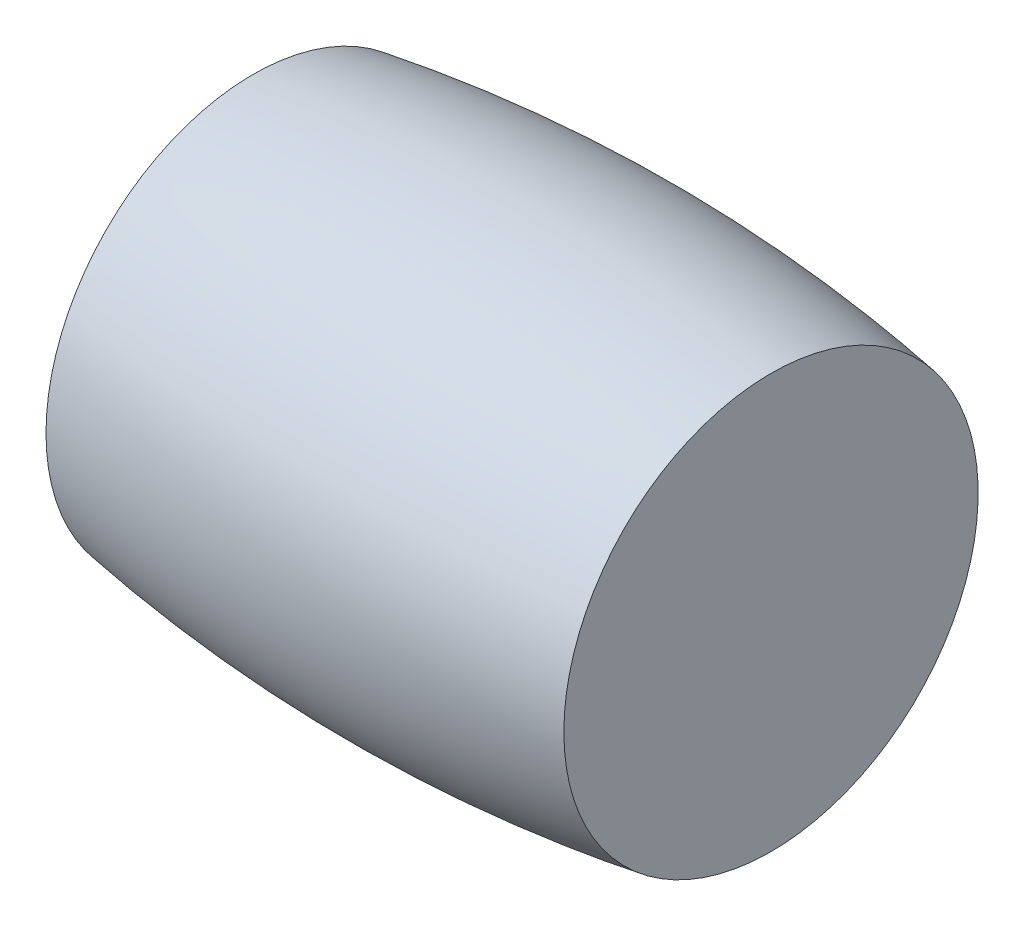
ISO-10303-21;
HEADER;
FILE_DESCRIPTION(('STEP AP214'),'2;1');
FILE_NAME('part.step','',(''),(''),'','','');
FILE_SCHEMA(('AUTOMOTIVE_DESIGN { 1 0 10303 214 1 1 1 1 }'));
ENDSEC;
DATA;
#1=APPLICATION_CONTEXT('core data for automotive mechanical design processes');
#2=APPLICATION_PROTOCOL_DEFINITION('international standard','automotive_design',2000,#1);
#3=PRODUCT_CONTEXT('',#1,'mechanical');
#4=PRODUCT('Part','Part','',(#3));
#5=PRODUCT_RELATED_PRODUCT_CATEGORY('part','',(#4));
#6=PRODUCT_DEFINITION_FORMATION('','',#4);
#7=PRODUCT_DEFINITION_CONTEXT('part definition',#1,'design');
#8=PRODUCT_DEFINITION('design','',#6,#7);
#9=PRODUCT_DEFINITION_SHAPE('','',#8);
#10=(LENGTH_UNIT() NAMED_UNIT(*) SI_UNIT(.MILLI.,.METRE.));
#11=(NAMED_UNIT(*) PLANE_ANGLE_UNIT() SI_UNIT($,.RADIAN.));
#12=(NAMED_UNIT(*) SI_UNIT($,.STERADIAN.) SOLID_ANGLE_UNIT());
#13=UNCERTAINTY_MEASURE_WITH_UNIT(LENGTH_MEASURE(1.E-05),#10,'distance_accuracy_value','');
#14=(GEOMETRIC_REPRESENTATION_CONTEXT(3) GLOBAL_UNCERTAINTY_ASSIGNED_CONTEXT((#13)) GLOBAL_UNIT_ASSIGNED_CONTEXT((#10,
#11,#12)) REPRESENTATION_CONTEXT('',''));
#15=CARTESIAN_POINT('',(0.,0.,0.));
#16=DIRECTION('',(0.,0.,1.));
#17=DIRECTION('',(1.,0.,0.));
#18=AXIS2_PLACEMENT_3D('',#15,#16,#17);
#19=CARTESIAN_POINT('',(7.5,0.,0.));
#20=DIRECTION('',(-1.,0.,0.));
#21=DIRECTION('',(0.,0.,1.));
#22=AXIS2_PLACEMENT_3D('',#19,#20,#21);
#23=PLANE('',#22);
#24=CARTESIAN_POINT('',(7.50000000000001,0.,0.));
#25=DIRECTION('',(-1.,0.,0.));
#26=DIRECTION('',(0.,0.,1.));
#27=AXIS2_PLACEMENT_3D('',#24,#25,#26);
#28=CIRCLE('',#27,6.);
#29=CARTESIAN_POINT('',(7.50000000000001,0.,6.));
#30=VERTEX_POINT('',#29);
#31=EDGE_CURVE('E10',#30,#30,#28,.T.);
#32=ORIENTED_EDGE('',*,*,#31,.F.);
#33=EDGE_LOOP('',(#32));
#34=FACE_BOUND('',#33,.T.);
#35=ADVANCED_FACE('F38',(#34),#23,.F.);
#36=CARTESIAN_POINT('',(0.,0.,0.));
#37=DIRECTION('',(-1.,0.,0.));
#38=DIRECTION('',(0.,0.,1.));
#39=AXIS2_PLACEMENT_3D('',#36,#37,#38);
#40=DEGENERATE_TOROIDAL_SURFACE('',#39,40.575,47.175,.F.);
#41=CARTESIAN_POINT('',(-7.5,0.,0.));
#42=DIRECTION('',(-1.,0.,0.));
#43=DIRECTION('',(0.,0.,1.));
#44=AXIS2_PLACEMENT_3D('',#41,#42,#43);
#45=CIRCLE('',#44,6.);
#46=CARTESIAN_POINT('',(-7.5,0.,6.));
#47=VERTEX_POINT('',#46);
#48=EDGE_CURVE('E44',#47,#47,#45,.T.);
#49=ORIENTED_EDGE('',*,*,#48,.F.);
#50=EDGE_LOOP('',(#49));
#51=FACE_BOUND('',#50,.T.);
#52=ORIENTED_EDGE('',*,*,#31,.T.);
#53=EDGE_LOOP('',(#52));
#54=FACE_BOUND('',#53,.T.);
#55=ADVANCED_FACE('F52',(#51,#54),#40,.F.);
#56=CARTESIAN_POINT('',(-7.5,0.,0.));
#57=DIRECTION('',(1.,0.,0.));
#58=DIRECTION('',(0.,0.,-1.));
#59=AXIS2_PLACEMENT_3D('',#56,#57,#58);
#60=PLANE('',#59);
#61=ORIENTED_EDGE('',*,*,#48,.T.);
#62=EDGE_LOOP('',(#61));
#63=FACE_BOUND('',#62,.T.);
#64=ADVANCED_FACE('F50',(#63),#60,.F.);
#65=CLOSED_SHELL('',(#35,#55,#64));
#66=MANIFOLD_SOLID_BREP('B2',#65);
#67=ADVANCED_BREP_SHAPE_REPRESENTATION('',(#18,#66),#14);
#68=SHAPE_DEFINITION_REPRESENTATION(#9,#67);
ENDSEC;
END-ISO-10303-21;
